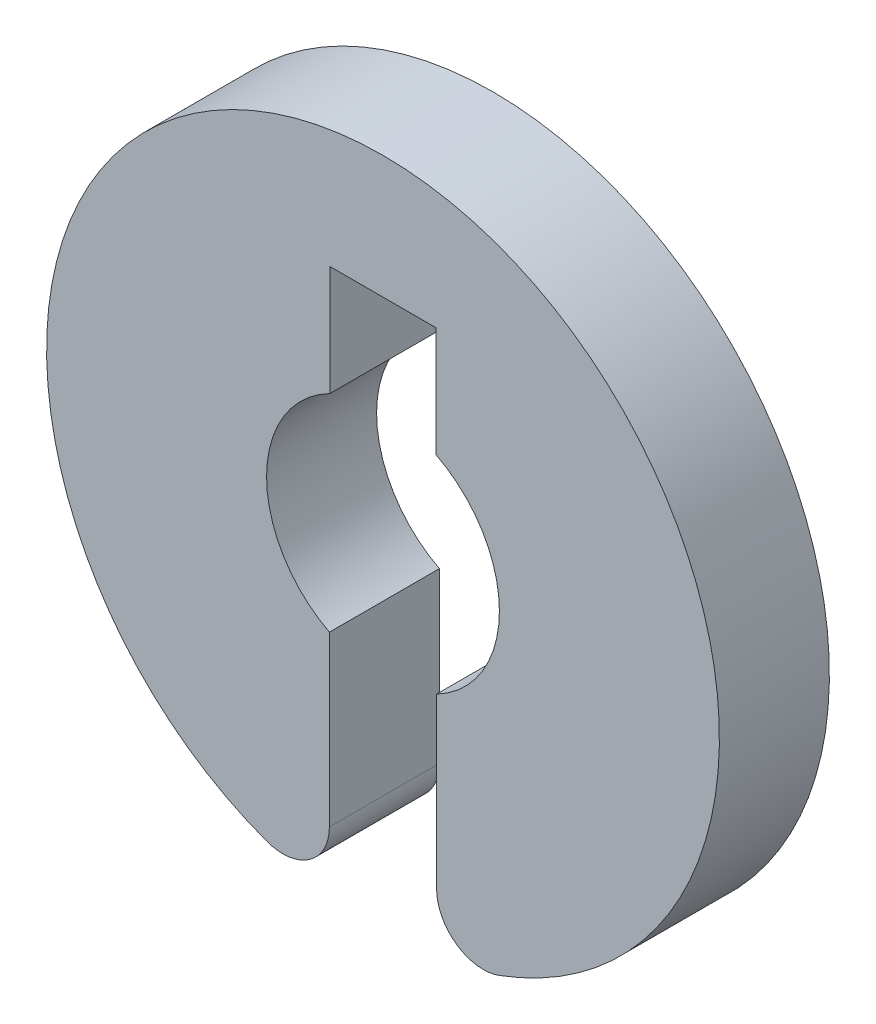
ISO-10303-21;
HEADER;
FILE_DESCRIPTION(('STEP AP214'),'2;1');
FILE_NAME('part.step','',(''),(''),'','','');
FILE_SCHEMA(('AUTOMOTIVE_DESIGN { 1 0 10303 214 1 1 1 1 }'));
ENDSEC;
DATA;
#1=APPLICATION_CONTEXT('core data for automotive mechanical design processes');
#2=APPLICATION_PROTOCOL_DEFINITION('international standard','automotive_design',2000,#1);
#3=PRODUCT_CONTEXT('',#1,'mechanical');
#4=PRODUCT('Part','Part','',(#3));
#5=PRODUCT_RELATED_PRODUCT_CATEGORY('part','',(#4));
#6=PRODUCT_DEFINITION_FORMATION('','',#4);
#7=PRODUCT_DEFINITION_CONTEXT('part definition',#1,'design');
#8=PRODUCT_DEFINITION('design','',#6,#7);
#9=PRODUCT_DEFINITION_SHAPE('','',#8);
#10=(LENGTH_UNIT() NAMED_UNIT(*) SI_UNIT(.MILLI.,.METRE.));
#11=(NAMED_UNIT(*) PLANE_ANGLE_UNIT() SI_UNIT($,.RADIAN.));
#12=(NAMED_UNIT(*) SI_UNIT($,.STERADIAN.) SOLID_ANGLE_UNIT());
#13=UNCERTAINTY_MEASURE_WITH_UNIT(LENGTH_MEASURE(1.E-05),#10,'distance_accuracy_value','');
#14=(GEOMETRIC_REPRESENTATION_CONTEXT(3) GLOBAL_UNCERTAINTY_ASSIGNED_CONTEXT((#13)) GLOBAL_UNIT_ASSIGNED_CONTEXT((#10,
#11,#12)) REPRESENTATION_CONTEXT('',''));
#15=CARTESIAN_POINT('',(0.,0.,0.));
#16=DIRECTION('',(0.,0.,1.));
#17=DIRECTION('',(1.,0.,0.));
#18=AXIS2_PLACEMENT_3D('',#15,#16,#17);
#19=CARTESIAN_POINT('',(0.,0.,3.));
#20=DIRECTION('',(0.,0.,-1.));
#21=DIRECTION('',(-1.,0.,0.));
#22=AXIS2_PLACEMENT_3D('',#19,#20,#21);
#23=CYLINDRICAL_SURFACE('',#22,3.17500000000001);
#24=CARTESIAN_POINT('',(0.,0.,0.));
#25=DIRECTION('',(0.,0.,-1.));
#26=DIRECTION('',(1.,0.,0.));
#27=AXIS2_PLACEMENT_3D('',#24,#25,#26);
#28=CIRCLE('',#27,3.17500000000001);
#29=CARTESIAN_POINT('',(1.4475,2.82583947704041,0.));
#30=VERTEX_POINT('',#29);
#31=CARTESIAN_POINT('',(1.4625,-2.8181055249937,0.));
#32=VERTEX_POINT('',#31);
#33=EDGE_CURVE('E137',#30,#32,#28,.T.);
#34=ORIENTED_EDGE('',*,*,#33,.T.);
#35=DIRECTION('',(0.,0.,-1.));
#36=VECTOR('',#35,1.);
#37=CARTESIAN_POINT('',(1.4625,-2.8181055249937,3.));
#38=LINE('',#37,#36);
#39=CARTESIAN_POINT('',(1.4625,-2.8181055249937,3.));
#40=VERTEX_POINT('',#39);
#41=EDGE_CURVE('E125',#40,#32,#38,.T.);
#42=ORIENTED_EDGE('',*,*,#41,.F.);
#43=CARTESIAN_POINT('',(0.,0.,3.));
#44=DIRECTION('',(0.,0.,-1.));
#45=DIRECTION('',(1.,0.,0.));
#46=AXIS2_PLACEMENT_3D('',#43,#44,#45);
#47=CIRCLE('',#46,3.17500000000001);
#48=CARTESIAN_POINT('',(1.4475,2.82583947704041,3.));
#49=VERTEX_POINT('',#48);
#50=EDGE_CURVE('E130',#49,#40,#47,.T.);
#51=ORIENTED_EDGE('',*,*,#50,.F.);
#52=DIRECTION('',(0.,0.,-1.));
#53=VECTOR('',#52,1.);
#54=CARTESIAN_POINT('',(1.4475,2.82583947704041,3.));
#55=LINE('',#54,#53);
#56=EDGE_CURVE('E183',#49,#30,#55,.T.);
#57=ORIENTED_EDGE('',*,*,#56,.T.);
#58=EDGE_LOOP('',(#34,#42,#51,#57));
#59=FACE_BOUND('',#58,.T.);
#60=ADVANCED_FACE('F45',(#59),#23,.F.);
#61=CARTESIAN_POINT('',(1.4625,-9.05768837783681,3.));
#62=DIRECTION('',(1.,0.,0.));
#63=DIRECTION('',(0.,0.,-1.));
#64=AXIS2_PLACEMENT_3D('',#61,#62,#63);
#65=PLANE('',#64);
#66=DIRECTION('',(0.,-1.,0.));
#67=VECTOR('',#66,1.);
#68=CARTESIAN_POINT('',(1.4625,-9.05768837783681,0.));
#69=LINE('',#68,#67);
#70=CARTESIAN_POINT('',(1.4625,-7.4177131752313,0.));
#71=VERTEX_POINT('',#70);
#72=EDGE_CURVE('E190',#32,#71,#69,.T.);
#73=ORIENTED_EDGE('',*,*,#72,.T.);
#74=DIRECTION('',(0.,0.,-1.));
#75=VECTOR('',#74,1.);
#76=CARTESIAN_POINT('',(1.4625,-7.4177131752313,3.));
#77=LINE('',#76,#75);
#78=CARTESIAN_POINT('',(1.4625,-7.4177131752313,3.));
#79=VERTEX_POINT('',#78);
#80=EDGE_CURVE('E12',#71,#79,#77,.F.);
#81=ORIENTED_EDGE('',*,*,#80,.T.);
#82=DIRECTION('',(0.,-1.,0.));
#83=VECTOR('',#82,1.);
#84=CARTESIAN_POINT('',(1.4625,-9.05768837783681,3.));
#85=LINE('',#84,#83);
#86=EDGE_CURVE('E119',#40,#79,#85,.T.);
#87=ORIENTED_EDGE('',*,*,#86,.F.);
#88=ORIENTED_EDGE('',*,*,#41,.T.);
#89=EDGE_LOOP('',(#73,#81,#87,#88));
#90=FACE_BOUND('',#89,.T.);
#91=ADVANCED_FACE('F118',(#90),#65,.F.);
#92=CARTESIAN_POINT('',(0.,0.,3.));
#93=DIRECTION('',(0.,0.,-1.));
#94=DIRECTION('',(-1.,0.,0.));
#95=AXIS2_PLACEMENT_3D('',#92,#93,#94);
#96=CYLINDRICAL_SURFACE('',#95,9.175);
#97=CARTESIAN_POINT('',(0.,0.,0.));
#98=DIRECTION('',(0.,0.,1.));
#99=DIRECTION('',(-1.,0.,0.));
#100=AXIS2_PLACEMENT_3D('',#97,#98,#99);
#101=CIRCLE('',#100,9.175);
#102=CARTESIAN_POINT('',(3.17149746995572,-8.60942674038547,0.));
#103=VERTEX_POINT('',#102);
#104=CARTESIAN_POINT('',(-3.17149746995572,-8.60942674038547,0.));
#105=VERTEX_POINT('',#104);
#106=EDGE_CURVE('E186',#103,#105,#101,.T.);
#107=ORIENTED_EDGE('',*,*,#106,.T.);
#108=DIRECTION('',(0.,0.,-1.));
#109=VECTOR('',#108,1.);
#110=CARTESIAN_POINT('',(-3.17149746995572,-8.60942674038547,3.));
#111=LINE('',#110,#109);
#112=CARTESIAN_POINT('',(-3.17149746995572,-8.60942674038547,3.));
#113=VERTEX_POINT('',#112);
#114=EDGE_CURVE('E64',#105,#113,#111,.F.);
#115=ORIENTED_EDGE('',*,*,#114,.T.);
#116=CARTESIAN_POINT('',(0.,0.,3.));
#117=DIRECTION('',(0.,0.,1.));
#118=DIRECTION('',(-1.,0.,0.));
#119=AXIS2_PLACEMENT_3D('',#116,#117,#118);
#120=CIRCLE('',#119,9.175);
#121=CARTESIAN_POINT('',(3.17149746995572,-8.60942674038547,3.));
#122=VERTEX_POINT('',#121);
#123=EDGE_CURVE('E127',#122,#113,#120,.T.);
#124=ORIENTED_EDGE('',*,*,#123,.F.);
#125=DIRECTION('',(0.,0.,-1.));
#126=VECTOR('',#125,1.);
#127=CARTESIAN_POINT('',(3.17149746995572,-8.60942674038547,3.));
#128=LINE('',#127,#126);
#129=EDGE_CURVE('E152',#122,#103,#128,.T.);
#130=ORIENTED_EDGE('',*,*,#129,.T.);
#131=EDGE_LOOP('',(#107,#115,#124,#130));
#132=FACE_BOUND('',#131,.T.);
#133=ADVANCED_FACE('F233',(#132),#96,.T.);
#134=CARTESIAN_POINT('',(-1.4625,-9.05768837783681,3.));
#135=DIRECTION('',(-1.,0.,0.));
#136=DIRECTION('',(0.,0.,1.));
#137=AXIS2_PLACEMENT_3D('',#134,#135,#136);
#138=PLANE('',#137);
#139=DIRECTION('',(0.,1.,0.));
#140=VECTOR('',#139,1.);
#141=CARTESIAN_POINT('',(-1.4625,-9.05768837783681,3.));
#142=LINE('',#141,#140);
#143=CARTESIAN_POINT('',(-1.4625,-7.4177131752313,3.));
#144=VERTEX_POINT('',#143);
#145=CARTESIAN_POINT('',(-1.4625,-2.8181055249937,3.));
#146=VERTEX_POINT('',#145);
#147=EDGE_CURVE('E169',#144,#146,#142,.T.);
#148=ORIENTED_EDGE('',*,*,#147,.F.);
#149=DIRECTION('',(0.,0.,-1.));
#150=VECTOR('',#149,1.);
#151=CARTESIAN_POINT('',(-1.4625,-7.4177131752313,3.));
#152=LINE('',#151,#150);
#153=CARTESIAN_POINT('',(-1.4625,-7.4177131752313,0.));
#154=VERTEX_POINT('',#153);
#155=EDGE_CURVE('E139',#144,#154,#152,.T.);
#156=ORIENTED_EDGE('',*,*,#155,.T.);
#157=DIRECTION('',(0.,1.,0.));
#158=VECTOR('',#157,1.);
#159=CARTESIAN_POINT('',(-1.4625,-9.05768837783681,0.));
#160=LINE('',#159,#158);
#161=CARTESIAN_POINT('',(-1.4625,-2.8181055249937,0.));
#162=VERTEX_POINT('',#161);
#163=EDGE_CURVE('E193',#154,#162,#160,.T.);
#164=ORIENTED_EDGE('',*,*,#163,.T.);
#165=DIRECTION('',(0.,0.,-1.));
#166=VECTOR('',#165,1.);
#167=CARTESIAN_POINT('',(-1.4625,-2.8181055249937,3.));
#168=LINE('',#167,#166);
#169=EDGE_CURVE('E143',#146,#162,#168,.T.);
#170=ORIENTED_EDGE('',*,*,#169,.F.);
#171=EDGE_LOOP('',(#148,#156,#164,#170));
#172=FACE_BOUND('',#171,.T.);
#173=ADVANCED_FACE('F240',(#172),#138,.F.);
#174=CARTESIAN_POINT('',(0.,0.,3.));
#175=DIRECTION('',(0.,0.,-1.));
#176=DIRECTION('',(-1.,0.,0.));
#177=AXIS2_PLACEMENT_3D('',#174,#175,#176);
#178=CYLINDRICAL_SURFACE('',#177,3.17500000000001);
#179=CARTESIAN_POINT('',(0.,0.,0.));
#180=DIRECTION('',(0.,0.,-1.));
#181=DIRECTION('',(1.,0.,0.));
#182=AXIS2_PLACEMENT_3D('',#179,#180,#181);
#183=CIRCLE('',#182,3.17500000000001);
#184=CARTESIAN_POINT('',(-1.4475,2.82583947704041,0.));
#185=VERTEX_POINT('',#184);
#186=EDGE_CURVE('E191',#162,#185,#183,.T.);
#187=ORIENTED_EDGE('',*,*,#186,.T.);
#188=DIRECTION('',(0.,0.,-1.));
#189=VECTOR('',#188,1.);
#190=CARTESIAN_POINT('',(-1.4475,2.82583947704041,3.));
#191=LINE('',#190,#189);
#192=CARTESIAN_POINT('',(-1.4475,2.82583947704041,3.));
#193=VERTEX_POINT('',#192);
#194=EDGE_CURVE('E150',#193,#185,#191,.T.);
#195=ORIENTED_EDGE('',*,*,#194,.F.);
#196=CARTESIAN_POINT('',(0.,0.,3.));
#197=DIRECTION('',(0.,0.,-1.));
#198=DIRECTION('',(1.,0.,0.));
#199=AXIS2_PLACEMENT_3D('',#196,#197,#198);
#200=CIRCLE('',#199,3.17500000000001);
#201=EDGE_CURVE('E168',#146,#193,#200,.T.);
#202=ORIENTED_EDGE('',*,*,#201,.F.);
#203=ORIENTED_EDGE('',*,*,#169,.T.);
#204=EDGE_LOOP('',(#187,#195,#202,#203));
#205=FACE_BOUND('',#204,.T.);
#206=ADVANCED_FACE('F239',(#205),#178,.F.);
#207=CARTESIAN_POINT('',(-1.4475,5.82583947704041,3.));
#208=DIRECTION('',(-1.,0.,0.));
#209=DIRECTION('',(0.,-1.,0.));
#210=AXIS2_PLACEMENT_3D('',#207,#208,#209);
#211=PLANE('',#210);
#212=DIRECTION('',(0.,1.,0.));
#213=VECTOR('',#212,1.);
#214=CARTESIAN_POINT('',(-1.4475,5.82583947704041,0.));
#215=LINE('',#214,#213);
#216=CARTESIAN_POINT('',(-1.4475,5.82583947704041,0.));
#217=VERTEX_POINT('',#216);
#218=EDGE_CURVE('E194',#185,#217,#215,.T.);
#219=ORIENTED_EDGE('',*,*,#218,.T.);
#220=DIRECTION('',(0.,0.,-1.));
#221=VECTOR('',#220,1.);
#222=CARTESIAN_POINT('',(-1.4475,5.82583947704041,3.));
#223=LINE('',#222,#221);
#224=CARTESIAN_POINT('',(-1.4475,5.82583947704041,3.));
#225=VERTEX_POINT('',#224);
#226=EDGE_CURVE('E204',#225,#217,#223,.T.);
#227=ORIENTED_EDGE('',*,*,#226,.F.);
#228=DIRECTION('',(0.,1.,0.));
#229=VECTOR('',#228,1.);
#230=CARTESIAN_POINT('',(-1.4475,5.82583947704041,3.));
#231=LINE('',#230,#229);
#232=EDGE_CURVE('E171',#193,#225,#231,.T.);
#233=ORIENTED_EDGE('',*,*,#232,.F.);
#234=ORIENTED_EDGE('',*,*,#194,.T.);
#235=EDGE_LOOP('',(#219,#227,#233,#234));
#236=FACE_BOUND('',#235,.T.);
#237=ADVANCED_FACE('F211',(#236),#211,.F.);
#238=CARTESIAN_POINT('',(-1.4475,5.82583947704041,3.));
#239=DIRECTION('',(0.,1.,0.));
#240=DIRECTION('',(-1.,0.,0.));
#241=AXIS2_PLACEMENT_3D('',#238,#239,#240);
#242=PLANE('',#241);
#243=DIRECTION('',(1.,0.,0.));
#244=VECTOR('',#243,1.);
#245=CARTESIAN_POINT('',(-1.4475,5.82583947704041,0.));
#246=LINE('',#245,#244);
#247=CARTESIAN_POINT('',(1.4475,5.82583947704041,0.));
#248=VERTEX_POINT('',#247);
#249=EDGE_CURVE('E197',#217,#248,#246,.T.);
#250=ORIENTED_EDGE('',*,*,#249,.T.);
#251=DIRECTION('',(0.,0.,-1.));
#252=VECTOR('',#251,1.);
#253=CARTESIAN_POINT('',(1.4475,5.82583947704041,3.));
#254=LINE('',#253,#252);
#255=CARTESIAN_POINT('',(1.4475,5.82583947704041,3.));
#256=VERTEX_POINT('',#255);
#257=EDGE_CURVE('E203',#256,#248,#254,.T.);
#258=ORIENTED_EDGE('',*,*,#257,.F.);
#259=DIRECTION('',(1.,0.,0.));
#260=VECTOR('',#259,1.);
#261=CARTESIAN_POINT('',(-1.4475,5.82583947704041,3.));
#262=LINE('',#261,#260);
#263=EDGE_CURVE('E180',#225,#256,#262,.T.);
#264=ORIENTED_EDGE('',*,*,#263,.F.);
#265=ORIENTED_EDGE('',*,*,#226,.T.);
#266=EDGE_LOOP('',(#250,#258,#264,#265));
#267=FACE_BOUND('',#266,.T.);
#268=ADVANCED_FACE('F224',(#267),#242,.F.);
#269=CARTESIAN_POINT('',(1.4475,5.82583947704041,3.));
#270=DIRECTION('',(1.,0.,0.));
#271=DIRECTION('',(0.,1.,0.));
#272=AXIS2_PLACEMENT_3D('',#269,#270,#271);
#273=PLANE('',#272);
#274=DIRECTION('',(0.,-1.,0.));
#275=VECTOR('',#274,1.);
#276=CARTESIAN_POINT('',(1.4475,5.82583947704041,0.));
#277=LINE('',#276,#275);
#278=EDGE_CURVE('E138',#248,#30,#277,.T.);
#279=ORIENTED_EDGE('',*,*,#278,.T.);
#280=ORIENTED_EDGE('',*,*,#56,.F.);
#281=DIRECTION('',(0.,-1.,0.));
#282=VECTOR('',#281,1.);
#283=CARTESIAN_POINT('',(1.4475,5.82583947704041,3.));
#284=LINE('',#283,#282);
#285=EDGE_CURVE('E135',#256,#49,#284,.T.);
#286=ORIENTED_EDGE('',*,*,#285,.F.);
#287=ORIENTED_EDGE('',*,*,#257,.T.);
#288=EDGE_LOOP('',(#279,#280,#286,#287));
#289=FACE_BOUND('',#288,.T.);
#290=ADVANCED_FACE('F227',(#289),#273,.F.);
#291=CARTESIAN_POINT('',(0.,0.,3.));
#292=DIRECTION('',(0.,0.,1.));
#293=DIRECTION('',(1.,0.,0.));
#294=AXIS2_PLACEMENT_3D('',#291,#292,#293);
#295=PLANE('',#294);
#296=ORIENTED_EDGE('',*,*,#123,.T.);
#297=CARTESIAN_POINT('',(-2.7325,-7.4177131752313,3.));
#298=DIRECTION('',(0.,0.,1.));
#299=DIRECTION('',(1.,0.,0.));
#300=AXIS2_PLACEMENT_3D('',#297,#298,#299);
#301=CIRCLE('',#300,1.27);
#302=EDGE_CURVE('E49',#113,#144,#301,.T.);
#303=ORIENTED_EDGE('',*,*,#302,.T.);
#304=ORIENTED_EDGE('',*,*,#147,.T.);
#305=ORIENTED_EDGE('',*,*,#201,.T.);
#306=ORIENTED_EDGE('',*,*,#232,.T.);
#307=ORIENTED_EDGE('',*,*,#263,.T.);
#308=ORIENTED_EDGE('',*,*,#285,.T.);
#309=ORIENTED_EDGE('',*,*,#50,.T.);
#310=ORIENTED_EDGE('',*,*,#86,.T.);
#311=CARTESIAN_POINT('',(2.7325,-7.4177131752313,3.));
#312=DIRECTION('',(0.,0.,1.));
#313=DIRECTION('',(1.,0.,0.));
#314=AXIS2_PLACEMENT_3D('',#311,#312,#313);
#315=CIRCLE('',#314,1.27);
#316=EDGE_CURVE('E160',#79,#122,#315,.T.);
#317=ORIENTED_EDGE('',*,*,#316,.T.);
#318=EDGE_LOOP('',(#296,#303,#304,#305,#306,#307,#308,#309,#310,#317));
#319=FACE_BOUND('',#318,.T.);
#320=ADVANCED_FACE('F128',(#319),#295,.T.);
#321=CARTESIAN_POINT('',(0.,0.,0.));
#322=DIRECTION('',(0.,0.,1.));
#323=DIRECTION('',(1.,0.,0.));
#324=AXIS2_PLACEMENT_3D('',#321,#322,#323);
#325=PLANE('',#324);
#326=ORIENTED_EDGE('',*,*,#163,.F.);
#327=CARTESIAN_POINT('',(-2.7325,-7.4177131752313,0.));
#328=DIRECTION('',(0.,0.,1.));
#329=DIRECTION('',(1.,0.,0.));
#330=AXIS2_PLACEMENT_3D('',#327,#328,#329);
#331=CIRCLE('',#330,1.27);
#332=EDGE_CURVE('E155',#154,#105,#331,.F.);
#333=ORIENTED_EDGE('',*,*,#332,.T.);
#334=ORIENTED_EDGE('',*,*,#106,.F.);
#335=CARTESIAN_POINT('',(2.7325,-7.4177131752313,0.));
#336=DIRECTION('',(0.,0.,1.));
#337=DIRECTION('',(1.,0.,0.));
#338=AXIS2_PLACEMENT_3D('',#335,#336,#337);
#339=CIRCLE('',#338,1.27);
#340=EDGE_CURVE('E145',#103,#71,#339,.F.);
#341=ORIENTED_EDGE('',*,*,#340,.T.);
#342=ORIENTED_EDGE('',*,*,#72,.F.);
#343=ORIENTED_EDGE('',*,*,#33,.F.);
#344=ORIENTED_EDGE('',*,*,#278,.F.);
#345=ORIENTED_EDGE('',*,*,#249,.F.);
#346=ORIENTED_EDGE('',*,*,#218,.F.);
#347=ORIENTED_EDGE('',*,*,#186,.F.);
#348=EDGE_LOOP('',(#326,#333,#334,#341,#342,#343,#344,#345,#346,#347));
#349=FACE_BOUND('',#348,.T.);
#350=ADVANCED_FACE('F218',(#349),#325,.F.);
#351=CARTESIAN_POINT('',(-2.7325,-7.4177131752313,3.));
#352=DIRECTION('',(0.,0.,-1.));
#353=DIRECTION('',(-1.,0.,0.));
#354=AXIS2_PLACEMENT_3D('',#351,#352,#353);
#355=CYLINDRICAL_SURFACE('',#354,1.27);
#356=ORIENTED_EDGE('',*,*,#302,.F.);
#357=ORIENTED_EDGE('',*,*,#114,.F.);
#358=ORIENTED_EDGE('',*,*,#332,.F.);
#359=ORIENTED_EDGE('',*,*,#155,.F.);
#360=EDGE_LOOP('',(#356,#357,#358,#359));
#361=FACE_BOUND('',#360,.T.);
#362=ADVANCED_FACE('F232',(#361),#355,.T.);
#363=CARTESIAN_POINT('',(2.7325,-7.4177131752313,3.));
#364=DIRECTION('',(0.,0.,-1.));
#365=DIRECTION('',(-1.,0.,0.));
#366=AXIS2_PLACEMENT_3D('',#363,#364,#365);
#367=CYLINDRICAL_SURFACE('',#366,1.27);
#368=ORIENTED_EDGE('',*,*,#316,.F.);
#369=ORIENTED_EDGE('',*,*,#80,.F.);
#370=ORIENTED_EDGE('',*,*,#340,.F.);
#371=ORIENTED_EDGE('',*,*,#129,.F.);
#372=EDGE_LOOP('',(#368,#369,#370,#371));
#373=FACE_BOUND('',#372,.T.);
#374=ADVANCED_FACE('F42',(#373),#367,.T.);
#375=CLOSED_SHELL('',(#60,#91,#133,#173,#206,#237,#268,#290,#320,#350,#362,#374));
#376=MANIFOLD_SOLID_BREP('B2',#375);
#377=ADVANCED_BREP_SHAPE_REPRESENTATION('',(#18,#376),#14);
#378=SHAPE_DEFINITION_REPRESENTATION(#9,#377);
ENDSEC;
END-ISO-10303-21;
